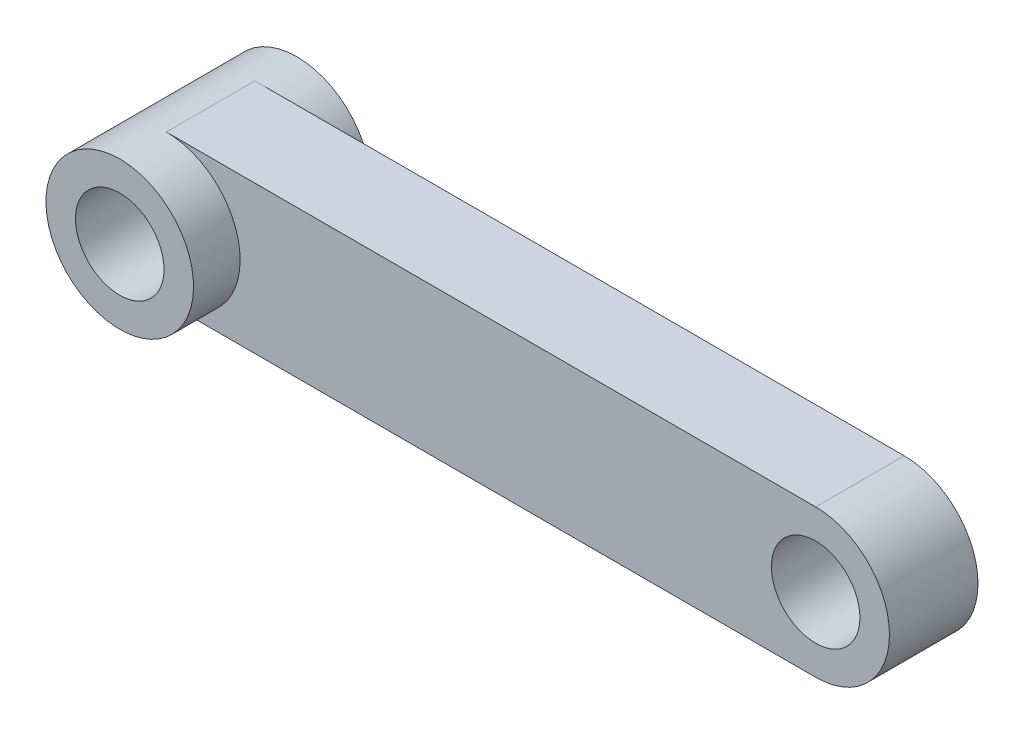
ISO-10303-21;
HEADER;
FILE_DESCRIPTION(('STEP AP214'),'2;1');
FILE_NAME('part.step','',(''),(''),'','','');
FILE_SCHEMA(('AUTOMOTIVE_DESIGN { 1 0 10303 214 1 1 1 1 }'));
ENDSEC;
DATA;
#1=APPLICATION_CONTEXT('core data for automotive mechanical design processes');
#2=APPLICATION_PROTOCOL_DEFINITION('international standard','automotive_design',2000,#1);
#3=PRODUCT_CONTEXT('',#1,'mechanical');
#4=PRODUCT('Part','Part','',(#3));
#5=PRODUCT_RELATED_PRODUCT_CATEGORY('part','',(#4));
#6=PRODUCT_DEFINITION_FORMATION('','',#4);
#7=PRODUCT_DEFINITION_CONTEXT('part definition',#1,'design');
#8=PRODUCT_DEFINITION('design','',#6,#7);
#9=PRODUCT_DEFINITION_SHAPE('','',#8);
#10=(LENGTH_UNIT() NAMED_UNIT(*) SI_UNIT(.MILLI.,.METRE.));
#11=(NAMED_UNIT(*) PLANE_ANGLE_UNIT() SI_UNIT($,.RADIAN.));
#12=(NAMED_UNIT(*) SI_UNIT($,.STERADIAN.) SOLID_ANGLE_UNIT());
#13=UNCERTAINTY_MEASURE_WITH_UNIT(LENGTH_MEASURE(1.E-05),#10,'distance_accuracy_value','');
#14=(GEOMETRIC_REPRESENTATION_CONTEXT(3) GLOBAL_UNCERTAINTY_ASSIGNED_CONTEXT((#13)) GLOBAL_UNIT_ASSIGNED_CONTEXT((#10,
#11,#12)) REPRESENTATION_CONTEXT('',''));
#15=CARTESIAN_POINT('',(0.,0.,0.));
#16=DIRECTION('',(0.,0.,1.));
#17=DIRECTION('',(1.,0.,0.));
#18=AXIS2_PLACEMENT_3D('',#15,#16,#17);
#19=CARTESIAN_POINT('',(0.,0.,-3.));
#20=DIRECTION('',(0.,0.,-1.));
#21=DIRECTION('',(1.,0.,0.));
#22=AXIS2_PLACEMENT_3D('',#19,#20,#21);
#23=PLANE('',#22);
#24=CARTESIAN_POINT('',(191.551801515187,-29.6689932137893,-3.));
#25=DIRECTION('',(0.,0.,1.));
#26=DIRECTION('',(1.,0.,0.));
#27=AXIS2_PLACEMENT_3D('',#24,#25,#26);
#28=CIRCLE('',#27,1.50000000000002);
#29=CARTESIAN_POINT('',(193.051801515187,-29.6689932137893,-3.));
#30=VERTEX_POINT('',#29);
#31=EDGE_CURVE('E85',#30,#30,#28,.F.);
#32=ORIENTED_EDGE('',*,*,#31,.F.);
#33=EDGE_LOOP('',(#32));
#34=FACE_BOUND('',#33,.T.);
#35=DIRECTION('',(1.,0.,0.));
#36=VECTOR('',#35,1.);
#37=CARTESIAN_POINT('',(0.,-27.1689932137895,-3.));
#38=LINE('',#37,#36);
#39=CARTESIAN_POINT('',(169.551801515187,-27.1689932137893,-3.));
#40=VERTEX_POINT('',#39);
#41=CARTESIAN_POINT('',(191.551801515187,-27.1689932137893,-3.));
#42=VERTEX_POINT('',#41);
#43=EDGE_CURVE('E106',#40,#42,#38,.T.);
#44=ORIENTED_EDGE('',*,*,#43,.T.);
#45=CARTESIAN_POINT('',(191.551801515187,-29.6689932137893,-3.));
#46=DIRECTION('',(0.,0.,1.));
#47=DIRECTION('',(1.,0.,0.));
#48=AXIS2_PLACEMENT_3D('',#45,#46,#47);
#49=CIRCLE('',#48,2.49999999999999);
#50=CARTESIAN_POINT('',(191.551801515187,-32.1689932137893,-3.));
#51=VERTEX_POINT('',#50);
#52=EDGE_CURVE('E109',#42,#51,#49,.F.);
#53=ORIENTED_EDGE('',*,*,#52,.T.);
#54=DIRECTION('',(-1.,0.,0.));
#55=VECTOR('',#54,1.);
#56=CARTESIAN_POINT('',(0.,-32.168993213789,-3.));
#57=LINE('',#56,#55);
#58=CARTESIAN_POINT('',(169.551801515187,-32.1689932137892,-3.));
#59=VERTEX_POINT('',#58);
#60=EDGE_CURVE('E98',#51,#59,#57,.T.);
#61=ORIENTED_EDGE('',*,*,#60,.T.);
#62=CARTESIAN_POINT('',(169.551801515187,-29.6689932137893,-3.));
#63=DIRECTION('',(0.,0.,1.));
#64=DIRECTION('',(1.,0.,0.));
#65=AXIS2_PLACEMENT_3D('',#62,#63,#64);
#66=CIRCLE('',#65,2.5);
#67=EDGE_CURVE('E83',#40,#59,#66,.F.);
#68=ORIENTED_EDGE('',*,*,#67,.F.);
#69=EDGE_LOOP('',(#44,#53,#61,#68));
#70=FACE_BOUND('',#69,.T.);
#71=ADVANCED_FACE('F34',(#34,#70),#23,.T.);
#72=CARTESIAN_POINT('',(0.,0.,0.));
#73=DIRECTION('',(0.,0.,-1.));
#74=DIRECTION('',(1.,0.,0.));
#75=AXIS2_PLACEMENT_3D('',#72,#73,#74);
#76=PLANE('',#75);
#77=CARTESIAN_POINT('',(191.551801515187,-29.6689932137893,0.));
#78=DIRECTION('',(0.,0.,1.));
#79=DIRECTION('',(1.,0.,0.));
#80=AXIS2_PLACEMENT_3D('',#77,#78,#79);
#81=CIRCLE('',#80,1.50000000000002);
#82=CARTESIAN_POINT('',(193.051801515187,-29.6689932137893,0.));
#83=VERTEX_POINT('',#82);
#84=EDGE_CURVE('E95',#83,#83,#81,.F.);
#85=ORIENTED_EDGE('',*,*,#84,.T.);
#86=EDGE_LOOP('',(#85));
#87=FACE_BOUND('',#86,.T.);
#88=CARTESIAN_POINT('',(169.551801515187,-29.6689932137893,0.));
#89=DIRECTION('',(0.,0.,1.));
#90=DIRECTION('',(1.,0.,0.));
#91=AXIS2_PLACEMENT_3D('',#88,#89,#90);
#92=CIRCLE('',#91,2.5);
#93=CARTESIAN_POINT('',(169.551801515187,-27.1689932137893,0.));
#94=VERTEX_POINT('',#93);
#95=CARTESIAN_POINT('',(169.551801515187,-32.1689932137892,0.));
#96=VERTEX_POINT('',#95);
#97=EDGE_CURVE('E11',#94,#96,#92,.F.);
#98=ORIENTED_EDGE('',*,*,#97,.T.);
#99=DIRECTION('',(-1.,0.,0.));
#100=VECTOR('',#99,1.);
#101=CARTESIAN_POINT('',(0.,-32.168993213789,0.));
#102=LINE('',#101,#100);
#103=CARTESIAN_POINT('',(191.551801515187,-32.1689932137893,0.));
#104=VERTEX_POINT('',#103);
#105=EDGE_CURVE('E88',#104,#96,#102,.T.);
#106=ORIENTED_EDGE('',*,*,#105,.F.);
#107=CARTESIAN_POINT('',(191.551801515187,-29.6689932137893,0.));
#108=DIRECTION('',(0.,0.,1.));
#109=DIRECTION('',(1.,0.,0.));
#110=AXIS2_PLACEMENT_3D('',#107,#108,#109);
#111=CIRCLE('',#110,2.49999999999999);
#112=CARTESIAN_POINT('',(191.551801515187,-27.1689932137893,0.));
#113=VERTEX_POINT('',#112);
#114=EDGE_CURVE('E91',#113,#104,#111,.F.);
#115=ORIENTED_EDGE('',*,*,#114,.F.);
#116=DIRECTION('',(1.,0.,0.));
#117=VECTOR('',#116,1.);
#118=CARTESIAN_POINT('',(0.,-27.1689932137895,0.));
#119=LINE('',#118,#117);
#120=EDGE_CURVE('E94',#94,#113,#119,.T.);
#121=ORIENTED_EDGE('',*,*,#120,.F.);
#122=EDGE_LOOP('',(#98,#106,#115,#121));
#123=FACE_BOUND('',#122,.T.);
#124=ADVANCED_FACE('F93',(#87,#123),#76,.F.);
#125=CARTESIAN_POINT('',(0.,-32.168993213789,-3.));
#126=DIRECTION('',(0.,-1.,0.));
#127=DIRECTION('',(1.,0.,0.));
#128=AXIS2_PLACEMENT_3D('',#125,#126,#127);
#129=PLANE('',#128);
#130=ORIENTED_EDGE('',*,*,#105,.T.);
#131=DIRECTION('',(0.,0.,1.));
#132=VECTOR('',#131,1.);
#133=CARTESIAN_POINT('',(169.551801515187,-32.1689932137892,-3.));
#134=LINE('',#133,#132);
#135=EDGE_CURVE('E51',#59,#96,#134,.T.);
#136=ORIENTED_EDGE('',*,*,#135,.F.);
#137=ORIENTED_EDGE('',*,*,#60,.F.);
#138=DIRECTION('',(0.,0.,1.));
#139=VECTOR('',#138,1.);
#140=CARTESIAN_POINT('',(191.551801515187,-32.1689932137893,-3.));
#141=LINE('',#140,#139);
#142=EDGE_CURVE('E43',#51,#104,#141,.T.);
#143=ORIENTED_EDGE('',*,*,#142,.T.);
#144=EDGE_LOOP('',(#130,#136,#137,#143));
#145=FACE_BOUND('',#144,.T.);
#146=ADVANCED_FACE('F36',(#145),#129,.T.);
#147=CARTESIAN_POINT('',(191.551801515187,-29.6689932137893,-3.));
#148=DIRECTION('',(0.,0.,1.));
#149=DIRECTION('',(-1.,0.,0.));
#150=AXIS2_PLACEMENT_3D('',#147,#148,#149);
#151=CYLINDRICAL_SURFACE('',#150,2.49999999999999);
#152=ORIENTED_EDGE('',*,*,#114,.T.);
#153=ORIENTED_EDGE('',*,*,#142,.F.);
#154=ORIENTED_EDGE('',*,*,#52,.F.);
#155=DIRECTION('',(0.,0.,1.));
#156=VECTOR('',#155,1.);
#157=CARTESIAN_POINT('',(191.551801515187,-27.1689932137893,-3.));
#158=LINE('',#157,#156);
#159=EDGE_CURVE('E66',#42,#113,#158,.T.);
#160=ORIENTED_EDGE('',*,*,#159,.T.);
#161=EDGE_LOOP('',(#152,#153,#154,#160));
#162=FACE_BOUND('',#161,.T.);
#163=ADVANCED_FACE('F166',(#162),#151,.T.);
#164=CARTESIAN_POINT('',(0.,-27.1689932137895,-3.));
#165=DIRECTION('',(0.,1.,0.));
#166=DIRECTION('',(-1.,0.,0.));
#167=AXIS2_PLACEMENT_3D('',#164,#165,#166);
#168=PLANE('',#167);
#169=ORIENTED_EDGE('',*,*,#120,.T.);
#170=ORIENTED_EDGE('',*,*,#159,.F.);
#171=ORIENTED_EDGE('',*,*,#43,.F.);
#172=DIRECTION('',(0.,0.,1.));
#173=VECTOR('',#172,1.);
#174=CARTESIAN_POINT('',(169.551801515187,-27.1689932137893,-3.));
#175=LINE('',#174,#173);
#176=EDGE_CURVE('E72',#40,#94,#175,.T.);
#177=ORIENTED_EDGE('',*,*,#176,.T.);
#178=EDGE_LOOP('',(#169,#170,#171,#177));
#179=FACE_BOUND('',#178,.T.);
#180=ADVANCED_FACE('F160',(#179),#168,.T.);
#181=CARTESIAN_POINT('',(169.551801515187,-29.6689932137893,-3.));
#182=DIRECTION('',(0.,0.,1.));
#183=DIRECTION('',(-1.,0.,0.));
#184=AXIS2_PLACEMENT_3D('',#181,#182,#183);
#185=CYLINDRICAL_SURFACE('',#184,2.49999999999997);
#186=ORIENTED_EDGE('',*,*,#176,.F.);
#187=ORIENTED_EDGE('',*,*,#67,.T.);
#188=ORIENTED_EDGE('',*,*,#135,.T.);
#189=ORIENTED_EDGE('',*,*,#97,.F.);
#190=EDGE_LOOP('',(#186,#187,#188,#189));
#191=FACE_BOUND('',#190,.T.);
#192=CARTESIAN_POINT('',(169.551801515187,-29.6689932137893,1.5788733093457));
#193=DIRECTION('',(0.,0.,-1.));
#194=DIRECTION('',(0.,1.,0.));
#195=AXIS2_PLACEMENT_3D('',#192,#193,#194);
#196=CIRCLE('',#195,2.5);
#197=CARTESIAN_POINT('',(169.551801515187,-27.1689932137893,1.5788733093457));
#198=VERTEX_POINT('',#197);
#199=EDGE_CURVE('E115',#198,#198,#196,.T.);
#200=ORIENTED_EDGE('',*,*,#199,.T.);
#201=EDGE_LOOP('',(#200));
#202=FACE_BOUND('',#201,.T.);
#203=CARTESIAN_POINT('',(169.551801515187,-29.6689932137893,-4.4211266906543));
#204=DIRECTION('',(0.,0.,-1.));
#205=DIRECTION('',(0.,1.,0.));
#206=AXIS2_PLACEMENT_3D('',#203,#204,#205);
#207=CIRCLE('',#206,2.5);
#208=CARTESIAN_POINT('',(169.551801515187,-27.1689932137893,-4.4211266906543));
#209=VERTEX_POINT('',#208);
#210=EDGE_CURVE('E121',#209,#209,#207,.F.);
#211=ORIENTED_EDGE('',*,*,#210,.T.);
#212=EDGE_LOOP('',(#211));
#213=FACE_BOUND('',#212,.T.);
#214=ADVANCED_FACE('F80',(#191,#202,#213),#185,.T.);
#215=CARTESIAN_POINT('',(191.551801515187,-29.6689932137893,-3.));
#216=DIRECTION('',(0.,0.,1.));
#217=DIRECTION('',(-1.,0.,0.));
#218=AXIS2_PLACEMENT_3D('',#215,#216,#217);
#219=CYLINDRICAL_SURFACE('',#218,1.50000000000002);
#220=ORIENTED_EDGE('',*,*,#31,.T.);
#221=EDGE_LOOP('',(#220));
#222=FACE_BOUND('',#221,.T.);
#223=ORIENTED_EDGE('',*,*,#84,.F.);
#224=EDGE_LOOP('',(#223));
#225=FACE_BOUND('',#224,.T.);
#226=ADVANCED_FACE('F140',(#222,#225),#219,.F.);
#227=CARTESIAN_POINT('',(93.7187821992358,-184.192181560367,1.57887330934615));
#228=DIRECTION('',(0.,0.,1.));
#229=DIRECTION('',(-0.279231137623937,-0.960223917521971,0.));
#230=AXIS2_PLACEMENT_3D('',#227,#228,#229);
#231=PLANE('',#230);
#232=CARTESIAN_POINT('',(169.551801515187,-29.6689932137894,1.5788733093457));
#233=DIRECTION('',(0.,0.,-1.));
#234=DIRECTION('',(-0.279231137623937,-0.960223917521971,0.));
#235=AXIS2_PLACEMENT_3D('',#232,#233,#234);
#236=CIRCLE('',#235,1.5);
#237=CARTESIAN_POINT('',(169.132954808751,-31.1093290900723,1.57887330934571));
#238=VERTEX_POINT('',#237);
#239=EDGE_CURVE('E114',#238,#238,#236,.F.);
#240=ORIENTED_EDGE('',*,*,#239,.F.);
#241=EDGE_LOOP('',(#240));
#242=FACE_BOUND('',#241,.T.);
#243=ORIENTED_EDGE('',*,*,#199,.F.);
#244=EDGE_LOOP('',(#243));
#245=FACE_BOUND('',#244,.T.);
#246=ADVANCED_FACE('F131',(#242,#245),#231,.T.);
#247=CARTESIAN_POINT('',(169.551801515187,-29.6689932137893,-3.));
#248=DIRECTION('',(0.,0.,1.));
#249=DIRECTION('',(-1.,0.,0.));
#250=AXIS2_PLACEMENT_3D('',#247,#248,#249);
#251=CYLINDRICAL_SURFACE('',#250,1.5);
#252=ORIENTED_EDGE('',*,*,#239,.T.);
#253=EDGE_LOOP('',(#252));
#254=FACE_BOUND('',#253,.T.);
#255=CARTESIAN_POINT('',(169.551801515187,-29.6689932137894,-4.4211266906543));
#256=DIRECTION('',(0.,0.,-1.));
#257=DIRECTION('',(-0.279231137623937,-0.960223917521971,0.));
#258=AXIS2_PLACEMENT_3D('',#255,#256,#257);
#259=CIRCLE('',#258,1.5);
#260=CARTESIAN_POINT('',(169.132954808751,-31.1093290900723,-4.42112669065429));
#261=VERTEX_POINT('',#260);
#262=EDGE_CURVE('E118',#261,#261,#259,.F.);
#263=ORIENTED_EDGE('',*,*,#262,.F.);
#264=EDGE_LOOP('',(#263));
#265=FACE_BOUND('',#264,.T.);
#266=ADVANCED_FACE('F129',(#254,#265),#251,.F.);
#267=CARTESIAN_POINT('',(93.7187821992358,-184.192181560367,-4.42112669065385));
#268=DIRECTION('',(0.,0.,1.));
#269=DIRECTION('',(-0.279231137623937,-0.960223917521971,0.));
#270=AXIS2_PLACEMENT_3D('',#267,#268,#269);
#271=PLANE('',#270);
#272=ORIENTED_EDGE('',*,*,#210,.F.);
#273=EDGE_LOOP('',(#272));
#274=FACE_BOUND('',#273,.T.);
#275=ORIENTED_EDGE('',*,*,#262,.T.);
#276=EDGE_LOOP('',(#275));
#277=FACE_BOUND('',#276,.T.);
#278=ADVANCED_FACE('F127',(#274,#277),#271,.F.);
#279=CLOSED_SHELL('',(#71,#124,#146,#163,#180,#214,#226,#246,#266,#278));
#280=MANIFOLD_SOLID_BREP('B2',#279);
#281=ADVANCED_BREP_SHAPE_REPRESENTATION('',(#18,#280),#14);
#282=SHAPE_DEFINITION_REPRESENTATION(#9,#281);
ENDSEC;
END-ISO-10303-21;
